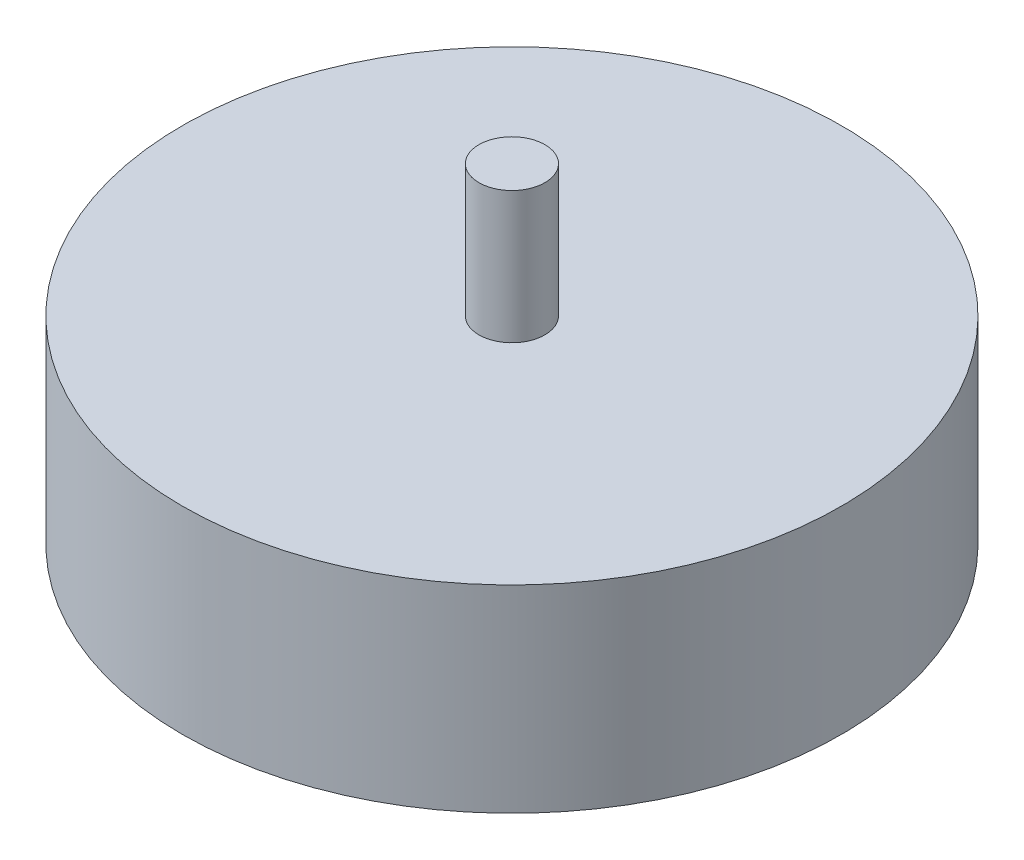
ISO-10303-21;
HEADER;
FILE_DESCRIPTION(('STEP AP214'),'2;1');
FILE_NAME('part.step','',(''),(''),'','','');
FILE_SCHEMA(('AUTOMOTIVE_DESIGN { 1 0 10303 214 1 1 1 1 }'));
ENDSEC;
DATA;
#1=APPLICATION_CONTEXT('core data for automotive mechanical design processes');
#2=APPLICATION_PROTOCOL_DEFINITION('international standard','automotive_design',2000,#1);
#3=PRODUCT_CONTEXT('',#1,'mechanical');
#4=PRODUCT('Part','Part','',(#3));
#5=PRODUCT_RELATED_PRODUCT_CATEGORY('part','',(#4));
#6=PRODUCT_DEFINITION_FORMATION('','',#4);
#7=PRODUCT_DEFINITION_CONTEXT('part definition',#1,'design');
#8=PRODUCT_DEFINITION('design','',#6,#7);
#9=PRODUCT_DEFINITION_SHAPE('','',#8);
#10=(LENGTH_UNIT() NAMED_UNIT(*) SI_UNIT(.MILLI.,.METRE.));
#11=(NAMED_UNIT(*) PLANE_ANGLE_UNIT() SI_UNIT($,.RADIAN.));
#12=(NAMED_UNIT(*) SI_UNIT($,.STERADIAN.) SOLID_ANGLE_UNIT());
#13=UNCERTAINTY_MEASURE_WITH_UNIT(LENGTH_MEASURE(1.E-05),#10,'distance_accuracy_value','');
#14=(GEOMETRIC_REPRESENTATION_CONTEXT(3) GLOBAL_UNCERTAINTY_ASSIGNED_CONTEXT((#13)) GLOBAL_UNIT_ASSIGNED_CONTEXT((#10,
#11,#12)) REPRESENTATION_CONTEXT('',''));
#15=CARTESIAN_POINT('',(0.,0.,0.));
#16=DIRECTION('',(0.,0.,1.));
#17=DIRECTION('',(1.,0.,0.));
#18=AXIS2_PLACEMENT_3D('',#15,#16,#17);
#19=CARTESIAN_POINT('',(0.,15.,0.));
#20=DIRECTION('',(0.,-1.,0.));
#21=DIRECTION('',(0.,0.,-1.));
#22=AXIS2_PLACEMENT_3D('',#19,#20,#21);
#23=CYLINDRICAL_SURFACE('',#22,25.);
#24=CARTESIAN_POINT('',(0.,15.,0.));
#25=DIRECTION('',(0.,1.,0.));
#26=DIRECTION('',(0.,0.,1.));
#27=AXIS2_PLACEMENT_3D('',#24,#25,#26);
#28=CIRCLE('',#27,25.);
#29=CARTESIAN_POINT('',(0.,15.,25.));
#30=VERTEX_POINT('',#29);
#31=EDGE_CURVE('E10',#30,#30,#28,.T.);
#32=ORIENTED_EDGE('',*,*,#31,.F.);
#33=EDGE_LOOP('',(#32));
#34=FACE_BOUND('',#33,.T.);
#35=CARTESIAN_POINT('',(0.,0.,0.));
#36=DIRECTION('',(0.,1.,0.));
#37=DIRECTION('',(0.,0.,1.));
#38=AXIS2_PLACEMENT_3D('',#35,#36,#37);
#39=CIRCLE('',#38,25.);
#40=CARTESIAN_POINT('',(0.,0.,25.));
#41=VERTEX_POINT('',#40);
#42=EDGE_CURVE('E40',#41,#41,#39,.T.);
#43=ORIENTED_EDGE('',*,*,#42,.T.);
#44=EDGE_LOOP('',(#43));
#45=FACE_BOUND('',#44,.T.);
#46=ADVANCED_FACE('F37',(#34,#45),#23,.T.);
#47=CARTESIAN_POINT('',(0.,15.,0.));
#48=DIRECTION('',(0.,1.,0.));
#49=DIRECTION('',(0.,0.,1.));
#50=AXIS2_PLACEMENT_3D('',#47,#48,#49);
#51=PLANE('',#50);
#52=CARTESIAN_POINT('',(0.,15.,0.));
#53=DIRECTION('',(0.,1.,0.));
#54=DIRECTION('',(0.,0.,1.));
#55=AXIS2_PLACEMENT_3D('',#52,#53,#54);
#56=CIRCLE('',#55,2.5);
#57=CARTESIAN_POINT('',(0.,15.,2.5));
#58=VERTEX_POINT('',#57);
#59=EDGE_CURVE('E59',#58,#58,#56,.T.);
#60=ORIENTED_EDGE('',*,*,#59,.F.);
#61=EDGE_LOOP('',(#60));
#62=FACE_BOUND('',#61,.T.);
#63=ORIENTED_EDGE('',*,*,#31,.T.);
#64=EDGE_LOOP('',(#63));
#65=FACE_BOUND('',#64,.T.);
#66=ADVANCED_FACE('F76',(#62,#65),#51,.T.);
#67=CARTESIAN_POINT('',(0.,0.,0.));
#68=DIRECTION('',(0.,1.,0.));
#69=DIRECTION('',(0.,0.,1.));
#70=AXIS2_PLACEMENT_3D('',#67,#68,#69);
#71=PLANE('',#70);
#72=CARTESIAN_POINT('',(0.,0.,0.));
#73=DIRECTION('',(0.,-1.,0.));
#74=DIRECTION('',(0.,0.,-1.));
#75=AXIS2_PLACEMENT_3D('',#72,#73,#74);
#76=CIRCLE('',#75,4.);
#77=CARTESIAN_POINT('',(0.,0.,-4.));
#78=VERTEX_POINT('',#77);
#79=EDGE_CURVE('E51',#78,#78,#76,.T.);
#80=ORIENTED_EDGE('',*,*,#79,.F.);
#81=EDGE_LOOP('',(#80));
#82=FACE_BOUND('',#81,.T.);
#83=ORIENTED_EDGE('',*,*,#42,.F.);
#84=EDGE_LOOP('',(#83));
#85=FACE_BOUND('',#84,.T.);
#86=ADVANCED_FACE('F78',(#82,#85),#71,.F.);
#87=CARTESIAN_POINT('',(0.,1.,0.));
#88=DIRECTION('',(0.,-1.,0.));
#89=DIRECTION('',(0.,0.,-1.));
#90=AXIS2_PLACEMENT_3D('',#87,#88,#89);
#91=CYLINDRICAL_SURFACE('',#90,4.);
#92=CARTESIAN_POINT('',(0.,1.,0.));
#93=DIRECTION('',(0.,-1.,0.));
#94=DIRECTION('',(0.,0.,-1.));
#95=AXIS2_PLACEMENT_3D('',#92,#93,#94);
#96=CIRCLE('',#95,4.);
#97=CARTESIAN_POINT('',(0.,1.,-4.));
#98=VERTEX_POINT('',#97);
#99=EDGE_CURVE('E49',#98,#98,#96,.T.);
#100=ORIENTED_EDGE('',*,*,#99,.F.);
#101=EDGE_LOOP('',(#100));
#102=FACE_BOUND('',#101,.T.);
#103=ORIENTED_EDGE('',*,*,#79,.T.);
#104=EDGE_LOOP('',(#103));
#105=FACE_BOUND('',#104,.T.);
#106=ADVANCED_FACE('F85',(#102,#105),#91,.F.);
#107=CARTESIAN_POINT('',(0.,1.,0.));
#108=DIRECTION('',(0.,-1.,0.));
#109=DIRECTION('',(0.,0.,-1.));
#110=AXIS2_PLACEMENT_3D('',#107,#108,#109);
#111=PLANE('',#110);
#112=ORIENTED_EDGE('',*,*,#99,.T.);
#113=EDGE_LOOP('',(#112));
#114=FACE_BOUND('',#113,.T.);
#115=ADVANCED_FACE('F72',(#114),#111,.T.);
#116=CARTESIAN_POINT('',(0.,25.,0.));
#117=DIRECTION('',(0.,-1.,0.));
#118=DIRECTION('',(0.,0.,-1.));
#119=AXIS2_PLACEMENT_3D('',#116,#117,#118);
#120=CYLINDRICAL_SURFACE('',#119,2.5);
#121=CARTESIAN_POINT('',(0.,25.,0.));
#122=DIRECTION('',(0.,1.,0.));
#123=DIRECTION('',(0.,0.,1.));
#124=AXIS2_PLACEMENT_3D('',#121,#122,#123);
#125=CIRCLE('',#124,2.5);
#126=CARTESIAN_POINT('',(0.,25.,2.5));
#127=VERTEX_POINT('',#126);
#128=EDGE_CURVE('E55',#127,#127,#125,.T.);
#129=ORIENTED_EDGE('',*,*,#128,.F.);
#130=EDGE_LOOP('',(#129));
#131=FACE_BOUND('',#130,.T.);
#132=ORIENTED_EDGE('',*,*,#59,.T.);
#133=EDGE_LOOP('',(#132));
#134=FACE_BOUND('',#133,.T.);
#135=ADVANCED_FACE('F69',(#131,#134),#120,.T.);
#136=CARTESIAN_POINT('',(0.,25.,0.));
#137=DIRECTION('',(0.,1.,0.));
#138=DIRECTION('',(0.,0.,1.));
#139=AXIS2_PLACEMENT_3D('',#136,#137,#138);
#140=PLANE('',#139);
#141=ORIENTED_EDGE('',*,*,#128,.T.);
#142=EDGE_LOOP('',(#141));
#143=FACE_BOUND('',#142,.T.);
#144=ADVANCED_FACE('F67',(#143),#140,.T.);
#145=CLOSED_SHELL('',(#46,#66,#86,#106,#115,#135,#144));
#146=MANIFOLD_SOLID_BREP('B2',#145);
#147=ADVANCED_BREP_SHAPE_REPRESENTATION('',(#18,#146),#14);
#148=SHAPE_DEFINITION_REPRESENTATION(#9,#147);
ENDSEC;
END-ISO-10303-21;
